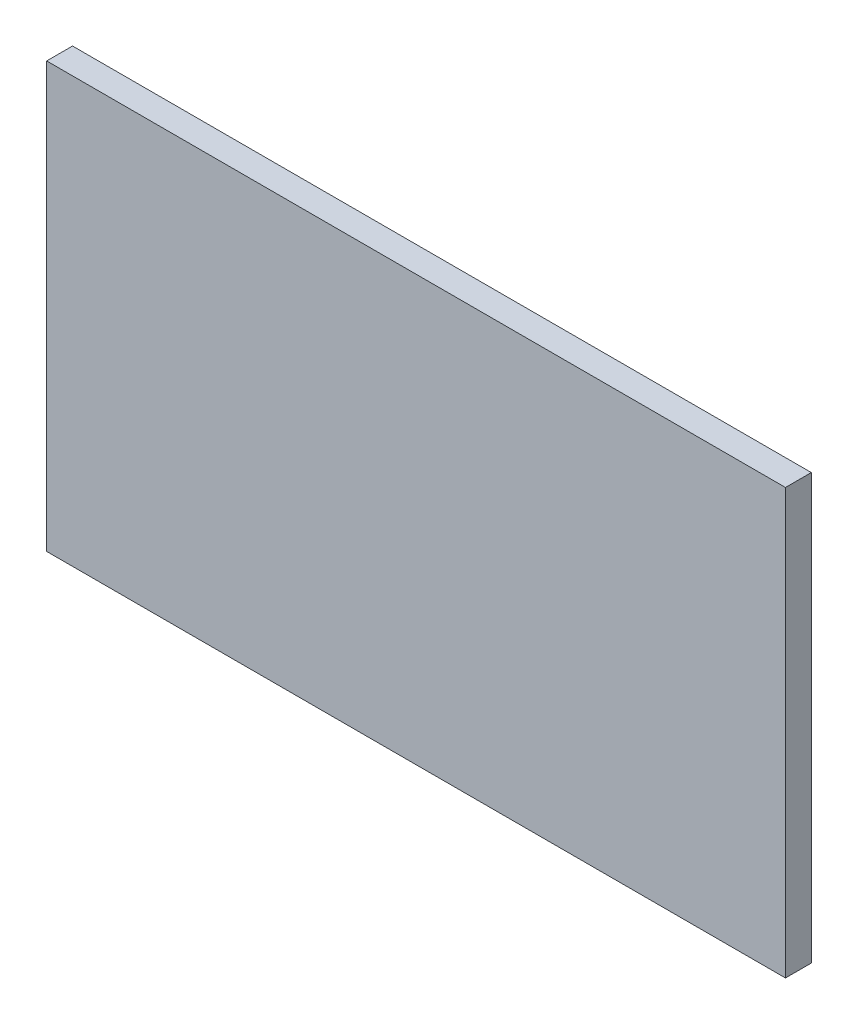
ISO-10303-21;
HEADER;
FILE_DESCRIPTION(('STEP AP214'),'2;1');
FILE_NAME('part.step','',(''),(''),'','','');
FILE_SCHEMA(('AUTOMOTIVE_DESIGN { 1 0 10303 214 1 1 1 1 }'));
ENDSEC;
DATA;
#1=APPLICATION_CONTEXT('core data for automotive mechanical design processes');
#2=APPLICATION_PROTOCOL_DEFINITION('international standard','automotive_design',2000,#1);
#3=PRODUCT_CONTEXT('',#1,'mechanical');
#4=PRODUCT('Part','Part','',(#3));
#5=PRODUCT_RELATED_PRODUCT_CATEGORY('part','',(#4));
#6=PRODUCT_DEFINITION_FORMATION('','',#4);
#7=PRODUCT_DEFINITION_CONTEXT('part definition',#1,'design');
#8=PRODUCT_DEFINITION('design','',#6,#7);
#9=PRODUCT_DEFINITION_SHAPE('','',#8);
#10=(LENGTH_UNIT() NAMED_UNIT(*) SI_UNIT(.MILLI.,.METRE.));
#11=(NAMED_UNIT(*) PLANE_ANGLE_UNIT() SI_UNIT($,.RADIAN.));
#12=(NAMED_UNIT(*) SI_UNIT($,.STERADIAN.) SOLID_ANGLE_UNIT());
#13=UNCERTAINTY_MEASURE_WITH_UNIT(LENGTH_MEASURE(1.E-05),#10,'distance_accuracy_value','');
#14=(GEOMETRIC_REPRESENTATION_CONTEXT(3) GLOBAL_UNCERTAINTY_ASSIGNED_CONTEXT((#13)) GLOBAL_UNIT_ASSIGNED_CONTEXT((#10,
#11,#12)) REPRESENTATION_CONTEXT('',''));
#15=CARTESIAN_POINT('',(0.,0.,0.));
#16=DIRECTION('',(0.,0.,1.));
#17=DIRECTION('',(1.,0.,0.));
#18=AXIS2_PLACEMENT_3D('',#15,#16,#17);
#19=CARTESIAN_POINT('',(254.,146.05,17.78));
#20=DIRECTION('',(-1.,0.,0.));
#21=DIRECTION('',(0.,-1.,0.));
#22=AXIS2_PLACEMENT_3D('',#19,#20,#21);
#23=PLANE('',#22);
#24=DIRECTION('',(0.,1.,0.));
#25=VECTOR('',#24,1.);
#26=CARTESIAN_POINT('',(254.,146.05,0.));
#27=LINE('',#26,#25);
#28=CARTESIAN_POINT('',(254.,-146.05,0.));
#29=VERTEX_POINT('',#28);
#30=CARTESIAN_POINT('',(254.,146.05,0.));
#31=VERTEX_POINT('',#30);
#32=EDGE_CURVE('E100',#29,#31,#27,.T.);
#33=ORIENTED_EDGE('',*,*,#32,.T.);
#34=DIRECTION('',(0.,0.,-1.));
#35=VECTOR('',#34,1.);
#36=CARTESIAN_POINT('',(254.,146.05,17.78));
#37=LINE('',#36,#35);
#38=CARTESIAN_POINT('',(254.,146.05,17.78));
#39=VERTEX_POINT('',#38);
#40=EDGE_CURVE('E11',#39,#31,#37,.T.);
#41=ORIENTED_EDGE('',*,*,#40,.F.);
#42=DIRECTION('',(0.,1.,0.));
#43=VECTOR('',#42,1.);
#44=CARTESIAN_POINT('',(254.,146.05,17.78));
#45=LINE('',#44,#43);
#46=CARTESIAN_POINT('',(254.,-146.05,17.78));
#47=VERTEX_POINT('',#46);
#48=EDGE_CURVE('E88',#47,#39,#45,.T.);
#49=ORIENTED_EDGE('',*,*,#48,.F.);
#50=DIRECTION('',(0.,0.,-1.));
#51=VECTOR('',#50,1.);
#52=CARTESIAN_POINT('',(254.,-146.05,17.78));
#53=LINE('',#52,#51);
#54=EDGE_CURVE('E96',#47,#29,#53,.T.);
#55=ORIENTED_EDGE('',*,*,#54,.T.);
#56=EDGE_LOOP('',(#33,#41,#49,#55));
#57=FACE_BOUND('',#56,.T.);
#58=ADVANCED_FACE('F37',(#57),#23,.F.);
#59=CARTESIAN_POINT('',(-254.,146.05,17.78));
#60=DIRECTION('',(0.,-1.,0.));
#61=DIRECTION('',(0.,0.,-1.));
#62=AXIS2_PLACEMENT_3D('',#59,#60,#61);
#63=PLANE('',#62);
#64=DIRECTION('',(-1.,0.,0.));
#65=VECTOR('',#64,1.);
#66=CARTESIAN_POINT('',(-254.,146.05,0.));
#67=LINE('',#66,#65);
#68=CARTESIAN_POINT('',(-254.,146.05,0.));
#69=VERTEX_POINT('',#68);
#70=EDGE_CURVE('E92',#31,#69,#67,.T.);
#71=ORIENTED_EDGE('',*,*,#70,.T.);
#72=DIRECTION('',(0.,0.,-1.));
#73=VECTOR('',#72,1.);
#74=CARTESIAN_POINT('',(-254.,146.05,17.78));
#75=LINE('',#74,#73);
#76=CARTESIAN_POINT('',(-254.,146.05,17.78));
#77=VERTEX_POINT('',#76);
#78=EDGE_CURVE('E45',#77,#69,#75,.T.);
#79=ORIENTED_EDGE('',*,*,#78,.F.);
#80=DIRECTION('',(-1.,0.,0.));
#81=VECTOR('',#80,1.);
#82=CARTESIAN_POINT('',(-254.,146.05,17.78));
#83=LINE('',#82,#81);
#84=EDGE_CURVE('E83',#39,#77,#83,.T.);
#85=ORIENTED_EDGE('',*,*,#84,.F.);
#86=ORIENTED_EDGE('',*,*,#40,.T.);
#87=EDGE_LOOP('',(#71,#79,#85,#86));
#88=FACE_BOUND('',#87,.T.);
#89=ADVANCED_FACE('F91',(#88),#63,.F.);
#90=CARTESIAN_POINT('',(-254.,146.05,17.78));
#91=DIRECTION('',(1.,0.,0.));
#92=DIRECTION('',(0.,0.,-1.));
#93=AXIS2_PLACEMENT_3D('',#90,#91,#92);
#94=PLANE('',#93);
#95=DIRECTION('',(0.,-1.,0.));
#96=VECTOR('',#95,1.);
#97=CARTESIAN_POINT('',(-254.,146.05,0.));
#98=LINE('',#97,#96);
#99=CARTESIAN_POINT('',(-254.,-146.05,0.));
#100=VERTEX_POINT('',#99);
#101=EDGE_CURVE('E70',#69,#100,#98,.T.);
#102=ORIENTED_EDGE('',*,*,#101,.T.);
#103=DIRECTION('',(0.,0.,-1.));
#104=VECTOR('',#103,1.);
#105=CARTESIAN_POINT('',(-254.,-146.05,17.78));
#106=LINE('',#105,#104);
#107=CARTESIAN_POINT('',(-254.,-146.05,17.78));
#108=VERTEX_POINT('',#107);
#109=EDGE_CURVE('E93',#108,#100,#106,.T.);
#110=ORIENTED_EDGE('',*,*,#109,.F.);
#111=DIRECTION('',(0.,-1.,0.));
#112=VECTOR('',#111,1.);
#113=CARTESIAN_POINT('',(-254.,146.05,17.78));
#114=LINE('',#113,#112);
#115=EDGE_CURVE('E86',#77,#108,#114,.T.);
#116=ORIENTED_EDGE('',*,*,#115,.F.);
#117=ORIENTED_EDGE('',*,*,#78,.T.);
#118=EDGE_LOOP('',(#102,#110,#116,#117));
#119=FACE_BOUND('',#118,.T.);
#120=ADVANCED_FACE('F94',(#119),#94,.F.);
#121=CARTESIAN_POINT('',(-254.,-146.05,17.78));
#122=DIRECTION('',(0.,1.,0.));
#123=DIRECTION('',(0.,0.,1.));
#124=AXIS2_PLACEMENT_3D('',#121,#122,#123);
#125=PLANE('',#124);
#126=DIRECTION('',(1.,0.,0.));
#127=VECTOR('',#126,1.);
#128=CARTESIAN_POINT('',(-254.,-146.05,0.));
#129=LINE('',#128,#127);
#130=EDGE_CURVE('E76',#100,#29,#129,.T.);
#131=ORIENTED_EDGE('',*,*,#130,.T.);
#132=ORIENTED_EDGE('',*,*,#54,.F.);
#133=DIRECTION('',(1.,0.,0.));
#134=VECTOR('',#133,1.);
#135=CARTESIAN_POINT('',(-254.,-146.05,17.78));
#136=LINE('',#135,#134);
#137=EDGE_CURVE('E53',#108,#47,#136,.T.);
#138=ORIENTED_EDGE('',*,*,#137,.F.);
#139=ORIENTED_EDGE('',*,*,#109,.T.);
#140=EDGE_LOOP('',(#131,#132,#138,#139));
#141=FACE_BOUND('',#140,.T.);
#142=ADVANCED_FACE('F107',(#141),#125,.F.);
#143=CARTESIAN_POINT('',(0.,0.,17.78));
#144=DIRECTION('',(0.,0.,1.));
#145=DIRECTION('',(1.,0.,0.));
#146=AXIS2_PLACEMENT_3D('',#143,#144,#145);
#147=PLANE('',#146);
#148=ORIENTED_EDGE('',*,*,#48,.T.);
#149=ORIENTED_EDGE('',*,*,#84,.T.);
#150=ORIENTED_EDGE('',*,*,#115,.T.);
#151=ORIENTED_EDGE('',*,*,#137,.T.);
#152=EDGE_LOOP('',(#148,#149,#150,#151));
#153=FACE_BOUND('',#152,.T.);
#154=ADVANCED_FACE('F84',(#153),#147,.T.);
#155=CARTESIAN_POINT('',(0.,0.,0.));
#156=DIRECTION('',(0.,0.,1.));
#157=DIRECTION('',(1.,0.,0.));
#158=AXIS2_PLACEMENT_3D('',#155,#156,#157);
#159=PLANE('',#158);
#160=ORIENTED_EDGE('',*,*,#32,.F.);
#161=ORIENTED_EDGE('',*,*,#130,.F.);
#162=ORIENTED_EDGE('',*,*,#101,.F.);
#163=ORIENTED_EDGE('',*,*,#70,.F.);
#164=EDGE_LOOP('',(#160,#161,#162,#163));
#165=FACE_BOUND('',#164,.T.);
#166=ADVANCED_FACE('F110',(#165),#159,.F.);
#167=CLOSED_SHELL('',(#58,#89,#120,#142,#154,#166));
#168=MANIFOLD_SOLID_BREP('B2',#167);
#169=ADVANCED_BREP_SHAPE_REPRESENTATION('',(#18,#168),#14);
#170=SHAPE_DEFINITION_REPRESENTATION(#9,#169);
ENDSEC;
END-ISO-10303-21;
